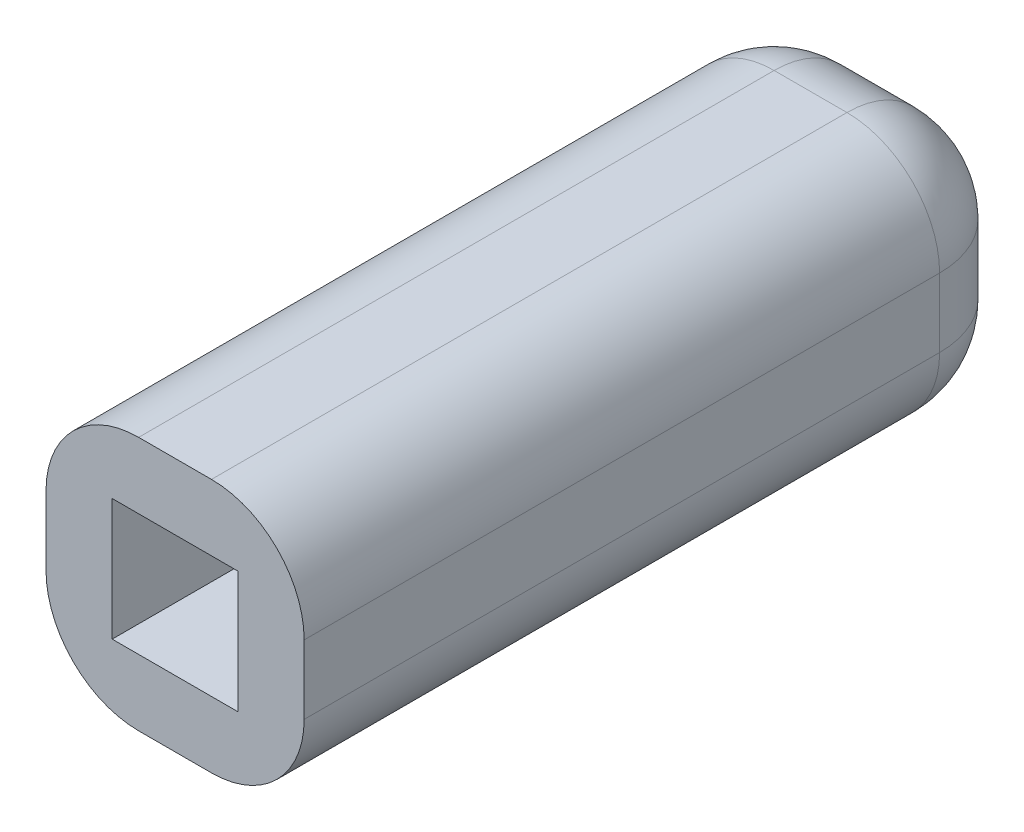
ISO-10303-21;
HEADER;
FILE_DESCRIPTION(('STEP AP214'),'2;1');
FILE_NAME('part.step','',(''),(''),'','','');
FILE_SCHEMA(('AUTOMOTIVE_DESIGN { 1 0 10303 214 1 1 1 1 }'));
ENDSEC;
DATA;
#1=APPLICATION_CONTEXT('core data for automotive mechanical design processes');
#2=APPLICATION_PROTOCOL_DEFINITION('international standard','automotive_design',2000,#1);
#3=PRODUCT_CONTEXT('',#1,'mechanical');
#4=PRODUCT('Part','Part','',(#3));
#5=PRODUCT_RELATED_PRODUCT_CATEGORY('part','',(#4));
#6=PRODUCT_DEFINITION_FORMATION('','',#4);
#7=PRODUCT_DEFINITION_CONTEXT('part definition',#1,'design');
#8=PRODUCT_DEFINITION('design','',#6,#7);
#9=PRODUCT_DEFINITION_SHAPE('','',#8);
#10=(LENGTH_UNIT() NAMED_UNIT(*) SI_UNIT(.MILLI.,.METRE.));
#11=(NAMED_UNIT(*) PLANE_ANGLE_UNIT() SI_UNIT($,.RADIAN.));
#12=(NAMED_UNIT(*) SI_UNIT($,.STERADIAN.) SOLID_ANGLE_UNIT());
#13=UNCERTAINTY_MEASURE_WITH_UNIT(LENGTH_MEASURE(1.E-05),#10,'distance_accuracy_value','');
#14=(GEOMETRIC_REPRESENTATION_CONTEXT(3) GLOBAL_UNCERTAINTY_ASSIGNED_CONTEXT((#13)) GLOBAL_UNIT_ASSIGNED_CONTEXT((#10,
#11,#12)) REPRESENTATION_CONTEXT('',''));
#15=CARTESIAN_POINT('',(0.,0.,0.));
#16=DIRECTION('',(0.,0.,1.));
#17=DIRECTION('',(1.,0.,0.));
#18=AXIS2_PLACEMENT_3D('',#15,#16,#17);
#19=CARTESIAN_POINT('',(0.,0.,55.));
#20=DIRECTION('',(1.,0.,0.));
#21=DIRECTION('',(0.,0.,-1.));
#22=AXIS2_PLACEMENT_3D('',#19,#20,#21);
#23=PLANE('',#22);
#24=DIRECTION('',(0.,0.,-1.));
#25=VECTOR('',#24,1.);
#26=CARTESIAN_POINT('',(0.,0.,55.));
#27=LINE('',#26,#25);
#28=CARTESIAN_POINT('',(0.,0.,55.));
#29=VERTEX_POINT('',#28);
#30=CARTESIAN_POINT('',(0.,0.,25.));
#31=VERTEX_POINT('',#30);
#32=EDGE_CURVE('E167',#29,#31,#27,.T.);
#33=ORIENTED_EDGE('',*,*,#32,.T.);
#34=DIRECTION('',(0.,-1.,0.));
#35=VECTOR('',#34,1.);
#36=CARTESIAN_POINT('',(0.,0.,25.));
#37=LINE('',#36,#35);
#38=CARTESIAN_POINT('',(0.,9.2,25.));
#39=VERTEX_POINT('',#38);
#40=EDGE_CURVE('E152',#39,#31,#37,.T.);
#41=ORIENTED_EDGE('',*,*,#40,.F.);
#42=DIRECTION('',(0.,0.,-1.));
#43=VECTOR('',#42,1.);
#44=CARTESIAN_POINT('',(0.,9.2,55.));
#45=LINE('',#44,#43);
#46=CARTESIAN_POINT('',(0.,9.2,55.));
#47=VERTEX_POINT('',#46);
#48=EDGE_CURVE('E164',#47,#39,#45,.T.);
#49=ORIENTED_EDGE('',*,*,#48,.F.);
#50=DIRECTION('',(0.,-1.,0.));
#51=VECTOR('',#50,1.);
#52=CARTESIAN_POINT('',(0.,0.,55.));
#53=LINE('',#52,#51);
#54=EDGE_CURVE('E169',#47,#29,#53,.T.);
#55=ORIENTED_EDGE('',*,*,#54,.T.);
#56=EDGE_LOOP('',(#33,#41,#49,#55));
#57=FACE_BOUND('',#56,.T.);
#58=ADVANCED_FACE('F49',(#57),#23,.T.);
#59=CARTESIAN_POINT('',(0.,0.,55.));
#60=DIRECTION('',(0.,1.,0.));
#61=DIRECTION('',(0.,0.,1.));
#62=AXIS2_PLACEMENT_3D('',#59,#60,#61);
#63=PLANE('',#62);
#64=DIRECTION('',(0.,0.,-1.));
#65=VECTOR('',#64,1.);
#66=CARTESIAN_POINT('',(9.5,0.,55.));
#67=LINE('',#66,#65);
#68=CARTESIAN_POINT('',(9.5,0.,55.));
#69=VERTEX_POINT('',#68);
#70=CARTESIAN_POINT('',(9.5,0.,25.));
#71=VERTEX_POINT('',#70);
#72=EDGE_CURVE('E180',#69,#71,#67,.T.);
#73=ORIENTED_EDGE('',*,*,#72,.T.);
#74=DIRECTION('',(-1.,0.,0.));
#75=VECTOR('',#74,1.);
#76=CARTESIAN_POINT('',(0.,0.,25.));
#77=LINE('',#76,#75);
#78=EDGE_CURVE('E170',#71,#31,#77,.T.);
#79=ORIENTED_EDGE('',*,*,#78,.T.);
#80=ORIENTED_EDGE('',*,*,#32,.F.);
#81=DIRECTION('',(1.,0.,0.));
#82=VECTOR('',#81,1.);
#83=CARTESIAN_POINT('',(0.,0.,55.));
#84=LINE('',#83,#82);
#85=EDGE_CURVE('E648',#29,#69,#84,.T.);
#86=ORIENTED_EDGE('',*,*,#85,.T.);
#87=EDGE_LOOP('',(#73,#79,#80,#86));
#88=FACE_BOUND('',#87,.T.);
#89=ADVANCED_FACE('F371',(#88),#63,.T.);
#90=CARTESIAN_POINT('',(9.5,0.,55.));
#91=DIRECTION('',(-1.,0.,0.));
#92=DIRECTION('',(0.,0.,1.));
#93=AXIS2_PLACEMENT_3D('',#90,#91,#92);
#94=PLANE('',#93);
#95=DIRECTION('',(0.,0.,-1.));
#96=VECTOR('',#95,1.);
#97=CARTESIAN_POINT('',(9.5,9.2,55.));
#98=LINE('',#97,#96);
#99=CARTESIAN_POINT('',(9.5,9.2,55.));
#100=VERTEX_POINT('',#99);
#101=CARTESIAN_POINT('',(9.5,9.2,25.));
#102=VERTEX_POINT('',#101);
#103=EDGE_CURVE('E176',#100,#102,#98,.T.);
#104=ORIENTED_EDGE('',*,*,#103,.T.);
#105=DIRECTION('',(0.,-1.,0.));
#106=VECTOR('',#105,1.);
#107=CARTESIAN_POINT('',(9.5,0.,25.));
#108=LINE('',#107,#106);
#109=EDGE_CURVE('E155',#102,#71,#108,.T.);
#110=ORIENTED_EDGE('',*,*,#109,.T.);
#111=ORIENTED_EDGE('',*,*,#72,.F.);
#112=DIRECTION('',(0.,1.,0.));
#113=VECTOR('',#112,1.);
#114=CARTESIAN_POINT('',(9.5,0.,55.));
#115=LINE('',#114,#113);
#116=EDGE_CURVE('E182',#69,#100,#115,.T.);
#117=ORIENTED_EDGE('',*,*,#116,.T.);
#118=EDGE_LOOP('',(#104,#110,#111,#117));
#119=FACE_BOUND('',#118,.T.);
#120=ADVANCED_FACE('F376',(#119),#94,.T.);
#121=CARTESIAN_POINT('',(0.,9.2,55.));
#122=DIRECTION('',(0.,-1.,0.));
#123=DIRECTION('',(0.,0.,-1.));
#124=AXIS2_PLACEMENT_3D('',#121,#122,#123);
#125=PLANE('',#124);
#126=ORIENTED_EDGE('',*,*,#48,.T.);
#127=DIRECTION('',(-1.,0.,0.));
#128=VECTOR('',#127,1.);
#129=CARTESIAN_POINT('',(0.,9.2,25.));
#130=LINE('',#129,#128);
#131=EDGE_CURVE('E149',#102,#39,#130,.T.);
#132=ORIENTED_EDGE('',*,*,#131,.F.);
#133=ORIENTED_EDGE('',*,*,#103,.F.);
#134=DIRECTION('',(-1.,0.,0.));
#135=VECTOR('',#134,1.);
#136=CARTESIAN_POINT('',(0.,9.2,55.));
#137=LINE('',#136,#135);
#138=EDGE_CURVE('E174',#100,#47,#137,.T.);
#139=ORIENTED_EDGE('',*,*,#138,.T.);
#140=EDGE_LOOP('',(#126,#132,#133,#139));
#141=FACE_BOUND('',#140,.T.);
#142=ADVANCED_FACE('F172',(#141),#125,.T.);
#143=CARTESIAN_POINT('',(0.,0.,55.));
#144=DIRECTION('',(0.,0.,-1.));
#145=DIRECTION('',(-1.,0.,0.));
#146=AXIS2_PLACEMENT_3D('',#143,#144,#145);
#147=PLANE('',#146);
#148=DIRECTION('',(0.,1.,0.));
#149=VECTOR('',#148,1.);
#150=CARTESIAN_POINT('',(14.5,-5.,55.));
#151=LINE('',#150,#149);
#152=CARTESIAN_POINT('',(14.5,2.,55.));
#153=VERTEX_POINT('',#152);
#154=CARTESIAN_POINT('',(14.5,7.2,55.));
#155=VERTEX_POINT('',#154);
#156=EDGE_CURVE('E199',#153,#155,#151,.T.);
#157=ORIENTED_EDGE('',*,*,#156,.T.);
#158=CARTESIAN_POINT('',(7.5,7.2,55.));
#159=DIRECTION('',(0.,0.,-1.));
#160=DIRECTION('',(-1.,0.,0.));
#161=AXIS2_PLACEMENT_3D('',#158,#159,#160);
#162=CIRCLE('',#161,7.);
#163=CARTESIAN_POINT('',(7.5,14.2,55.));
#164=VERTEX_POINT('',#163);
#165=EDGE_CURVE('E248',#155,#164,#162,.F.);
#166=ORIENTED_EDGE('',*,*,#165,.T.);
#167=DIRECTION('',(-1.,0.,0.));
#168=VECTOR('',#167,1.);
#169=CARTESIAN_POINT('',(-5.,14.2,55.));
#170=LINE('',#169,#168);
#171=CARTESIAN_POINT('',(2.,14.2,55.));
#172=VERTEX_POINT('',#171);
#173=EDGE_CURVE('E203',#164,#172,#170,.T.);
#174=ORIENTED_EDGE('',*,*,#173,.T.);
#175=CARTESIAN_POINT('',(2.,7.2,55.));
#176=DIRECTION('',(0.,0.,-1.));
#177=DIRECTION('',(-1.,0.,0.));
#178=AXIS2_PLACEMENT_3D('',#175,#176,#177);
#179=CIRCLE('',#178,7.);
#180=CARTESIAN_POINT('',(-5.,7.2,55.));
#181=VERTEX_POINT('',#180);
#182=EDGE_CURVE('E245',#172,#181,#179,.F.);
#183=ORIENTED_EDGE('',*,*,#182,.T.);
#184=DIRECTION('',(0.,-1.,0.));
#185=VECTOR('',#184,1.);
#186=CARTESIAN_POINT('',(-5.,-5.,55.));
#187=LINE('',#186,#185);
#188=CARTESIAN_POINT('',(-5.,2.,55.));
#189=VERTEX_POINT('',#188);
#190=EDGE_CURVE('E191',#181,#189,#187,.T.);
#191=ORIENTED_EDGE('',*,*,#190,.T.);
#192=CARTESIAN_POINT('',(2.,2.,55.));
#193=DIRECTION('',(0.,0.,-1.));
#194=DIRECTION('',(-1.,0.,0.));
#195=AXIS2_PLACEMENT_3D('',#192,#193,#194);
#196=CIRCLE('',#195,7.);
#197=CARTESIAN_POINT('',(2.,-5.,55.));
#198=VERTEX_POINT('',#197);
#199=EDGE_CURVE('E242',#189,#198,#196,.F.);
#200=ORIENTED_EDGE('',*,*,#199,.T.);
#201=DIRECTION('',(1.,0.,0.));
#202=VECTOR('',#201,1.);
#203=CARTESIAN_POINT('',(-5.,-5.,55.));
#204=LINE('',#203,#202);
#205=CARTESIAN_POINT('',(7.5,-5.,55.));
#206=VERTEX_POINT('',#205);
#207=EDGE_CURVE('E195',#198,#206,#204,.T.);
#208=ORIENTED_EDGE('',*,*,#207,.T.);
#209=CARTESIAN_POINT('',(7.5,2.,55.));
#210=DIRECTION('',(0.,0.,-1.));
#211=DIRECTION('',(-1.,0.,0.));
#212=AXIS2_PLACEMENT_3D('',#209,#210,#211);
#213=CIRCLE('',#212,7.);
#214=EDGE_CURVE('E239',#206,#153,#213,.F.);
#215=ORIENTED_EDGE('',*,*,#214,.T.);
#216=EDGE_LOOP('',(#157,#166,#174,#183,#191,#200,#208,#215));
#217=FACE_BOUND('',#216,.T.);
#218=ORIENTED_EDGE('',*,*,#54,.F.);
#219=ORIENTED_EDGE('',*,*,#138,.F.);
#220=ORIENTED_EDGE('',*,*,#116,.F.);
#221=ORIENTED_EDGE('',*,*,#85,.F.);
#222=EDGE_LOOP('',(#218,#219,#220,#221));
#223=FACE_BOUND('',#222,.T.);
#224=ADVANCED_FACE('F331',(#217,#223),#147,.F.);
#225=CARTESIAN_POINT('',(0.,0.,0.));
#226=DIRECTION('',(0.,0.,-1.));
#227=DIRECTION('',(-1.,0.,0.));
#228=AXIS2_PLACEMENT_3D('',#225,#226,#227);
#229=PLANE('',#228);
#230=DIRECTION('',(0.,-1.,0.));
#231=VECTOR('',#230,1.);
#232=CARTESIAN_POINT('',(2.,14.2,0.));
#233=LINE('',#232,#231);
#234=CARTESIAN_POINT('',(2.,2.,0.));
#235=VERTEX_POINT('',#234);
#236=CARTESIAN_POINT('',(2.,7.2,0.));
#237=VERTEX_POINT('',#236);
#238=EDGE_CURVE('E217',#235,#237,#233,.F.);
#239=ORIENTED_EDGE('',*,*,#238,.T.);
#240=DIRECTION('',(-1.,0.,0.));
#241=VECTOR('',#240,1.);
#242=CARTESIAN_POINT('',(14.5,7.2,0.));
#243=LINE('',#242,#241);
#244=CARTESIAN_POINT('',(7.5,7.2,0.));
#245=VERTEX_POINT('',#244);
#246=EDGE_CURVE('E226',#237,#245,#243,.F.);
#247=ORIENTED_EDGE('',*,*,#246,.T.);
#248=DIRECTION('',(0.,1.,0.));
#249=VECTOR('',#248,1.);
#250=CARTESIAN_POINT('',(7.5,-5.,0.));
#251=LINE('',#250,#249);
#252=CARTESIAN_POINT('',(7.5,2.,0.));
#253=VERTEX_POINT('',#252);
#254=EDGE_CURVE('E223',#245,#253,#251,.F.);
#255=ORIENTED_EDGE('',*,*,#254,.T.);
#256=DIRECTION('',(1.,0.,0.));
#257=VECTOR('',#256,1.);
#258=CARTESIAN_POINT('',(-5.,2.,0.));
#259=LINE('',#258,#257);
#260=EDGE_CURVE('E220',#253,#235,#259,.F.);
#261=ORIENTED_EDGE('',*,*,#260,.T.);
#262=EDGE_LOOP('',(#239,#247,#255,#261));
#263=FACE_BOUND('',#262,.T.);
#264=ADVANCED_FACE('F361',(#263),#229,.T.);
#265=CARTESIAN_POINT('',(-5.,-5.,55.));
#266=DIRECTION('',(1.,0.,0.));
#267=DIRECTION('',(0.,0.,-1.));
#268=AXIS2_PLACEMENT_3D('',#265,#266,#267);
#269=PLANE('',#268);
#270=ORIENTED_EDGE('',*,*,#190,.F.);
#271=DIRECTION('',(0.,0.,-1.));
#272=VECTOR('',#271,1.);
#273=CARTESIAN_POINT('',(-5.,7.2,55.));
#274=LINE('',#273,#272);
#275=CARTESIAN_POINT('',(-5.,7.2,7.));
#276=VERTEX_POINT('',#275);
#277=EDGE_CURVE('E257',#181,#276,#274,.T.);
#278=ORIENTED_EDGE('',*,*,#277,.T.);
#279=DIRECTION('',(0.,-1.,0.));
#280=VECTOR('',#279,1.);
#281=CARTESIAN_POINT('',(-5.,-5.,7.));
#282=LINE('',#281,#280);
#283=CARTESIAN_POINT('',(-5.,2.,7.));
#284=VERTEX_POINT('',#283);
#285=EDGE_CURVE('E251',#276,#284,#282,.T.);
#286=ORIENTED_EDGE('',*,*,#285,.T.);
#287=DIRECTION('',(0.,0.,-1.));
#288=VECTOR('',#287,1.);
#289=CARTESIAN_POINT('',(-5.,2.,55.));
#290=LINE('',#289,#288);
#291=EDGE_CURVE('E254',#284,#189,#290,.F.);
#292=ORIENTED_EDGE('',*,*,#291,.T.);
#293=EDGE_LOOP('',(#270,#278,#286,#292));
#294=FACE_BOUND('',#293,.T.);
#295=ADVANCED_FACE('F345',(#294),#269,.F.);
#296=CARTESIAN_POINT('',(-5.,-5.,55.));
#297=DIRECTION('',(0.,1.,0.));
#298=DIRECTION('',(0.,0.,1.));
#299=AXIS2_PLACEMENT_3D('',#296,#297,#298);
#300=PLANE('',#299);
#301=ORIENTED_EDGE('',*,*,#207,.F.);
#302=DIRECTION('',(0.,0.,-1.));
#303=VECTOR('',#302,1.);
#304=CARTESIAN_POINT('',(2.,-5.,55.));
#305=LINE('',#304,#303);
#306=CARTESIAN_POINT('',(2.,-5.,7.));
#307=VERTEX_POINT('',#306);
#308=EDGE_CURVE('E12',#198,#307,#305,.T.);
#309=ORIENTED_EDGE('',*,*,#308,.T.);
#310=DIRECTION('',(1.,0.,0.));
#311=VECTOR('',#310,1.);
#312=CARTESIAN_POINT('',(14.5,-5.,7.));
#313=LINE('',#312,#311);
#314=CARTESIAN_POINT('',(7.5,-5.,7.));
#315=VERTEX_POINT('',#314);
#316=EDGE_CURVE('E66',#307,#315,#313,.T.);
#317=ORIENTED_EDGE('',*,*,#316,.T.);
#318=DIRECTION('',(0.,0.,-1.));
#319=VECTOR('',#318,1.);
#320=CARTESIAN_POINT('',(7.5,-5.,55.));
#321=LINE('',#320,#319);
#322=EDGE_CURVE('E59',#315,#206,#321,.F.);
#323=ORIENTED_EDGE('',*,*,#322,.T.);
#324=EDGE_LOOP('',(#301,#309,#317,#323));
#325=FACE_BOUND('',#324,.T.);
#326=ADVANCED_FACE('F389',(#325),#300,.F.);
#327=CARTESIAN_POINT('',(14.5,-5.,55.));
#328=DIRECTION('',(-1.,0.,0.));
#329=DIRECTION('',(0.,0.,1.));
#330=AXIS2_PLACEMENT_3D('',#327,#328,#329);
#331=PLANE('',#330);
#332=DIRECTION('',(0.,1.,0.));
#333=VECTOR('',#332,1.);
#334=CARTESIAN_POINT('',(14.5,14.2,7.));
#335=LINE('',#334,#333);
#336=CARTESIAN_POINT('',(14.5,2.,7.));
#337=VERTEX_POINT('',#336);
#338=CARTESIAN_POINT('',(14.5,7.2,7.));
#339=VERTEX_POINT('',#338);
#340=EDGE_CURVE('E230',#337,#339,#335,.T.);
#341=ORIENTED_EDGE('',*,*,#340,.T.);
#342=DIRECTION('',(0.,0.,-1.));
#343=VECTOR('',#342,1.);
#344=CARTESIAN_POINT('',(14.5,7.2,55.));
#345=LINE('',#344,#343);
#346=EDGE_CURVE('E236',#339,#155,#345,.F.);
#347=ORIENTED_EDGE('',*,*,#346,.T.);
#348=ORIENTED_EDGE('',*,*,#156,.F.);
#349=DIRECTION('',(0.,0.,-1.));
#350=VECTOR('',#349,1.);
#351=CARTESIAN_POINT('',(14.5,2.,55.));
#352=LINE('',#351,#350);
#353=EDGE_CURVE('E233',#153,#337,#352,.T.);
#354=ORIENTED_EDGE('',*,*,#353,.T.);
#355=EDGE_LOOP('',(#341,#347,#348,#354));
#356=FACE_BOUND('',#355,.T.);
#357=ADVANCED_FACE('F320',(#356),#331,.F.);
#358=CARTESIAN_POINT('',(-5.,14.2,55.));
#359=DIRECTION('',(0.,-1.,0.));
#360=DIRECTION('',(0.,0.,-1.));
#361=AXIS2_PLACEMENT_3D('',#358,#359,#360);
#362=PLANE('',#361);
#363=ORIENTED_EDGE('',*,*,#173,.F.);
#364=DIRECTION('',(0.,0.,-1.));
#365=VECTOR('',#364,1.);
#366=CARTESIAN_POINT('',(7.5,14.2,55.));
#367=LINE('',#366,#365);
#368=CARTESIAN_POINT('',(7.5,14.2,7.));
#369=VERTEX_POINT('',#368);
#370=EDGE_CURVE('E214',#164,#369,#367,.T.);
#371=ORIENTED_EDGE('',*,*,#370,.T.);
#372=DIRECTION('',(-1.,0.,0.));
#373=VECTOR('',#372,1.);
#374=CARTESIAN_POINT('',(-5.,14.2,7.));
#375=LINE('',#374,#373);
#376=CARTESIAN_POINT('',(2.,14.2,7.));
#377=VERTEX_POINT('',#376);
#378=EDGE_CURVE('E210',#369,#377,#375,.T.);
#379=ORIENTED_EDGE('',*,*,#378,.T.);
#380=DIRECTION('',(0.,0.,-1.));
#381=VECTOR('',#380,1.);
#382=CARTESIAN_POINT('',(2.,14.2,55.));
#383=LINE('',#382,#381);
#384=EDGE_CURVE('E207',#377,#172,#383,.F.);
#385=ORIENTED_EDGE('',*,*,#384,.T.);
#386=EDGE_LOOP('',(#363,#371,#379,#385));
#387=FACE_BOUND('',#386,.T.);
#388=ADVANCED_FACE('F335',(#387),#362,.F.);
#389=CARTESIAN_POINT('',(0.,0.,25.));
#390=DIRECTION('',(0.,0.,-1.));
#391=DIRECTION('',(-1.,0.,0.));
#392=AXIS2_PLACEMENT_3D('',#389,#390,#391);
#393=PLANE('',#392);
#394=ORIENTED_EDGE('',*,*,#109,.F.);
#395=ORIENTED_EDGE('',*,*,#131,.T.);
#396=ORIENTED_EDGE('',*,*,#40,.T.);
#397=ORIENTED_EDGE('',*,*,#78,.F.);
#398=EDGE_LOOP('',(#394,#395,#396,#397));
#399=FACE_BOUND('',#398,.T.);
#400=ADVANCED_FACE('F151',(#399),#393,.F.);
#401=CARTESIAN_POINT('',(7.5,2.,55.));
#402=DIRECTION('',(0.,0.,-1.));
#403=DIRECTION('',(-1.,0.,0.));
#404=AXIS2_PLACEMENT_3D('',#401,#402,#403);
#405=CYLINDRICAL_SURFACE('',#404,7.);
#406=ORIENTED_EDGE('',*,*,#214,.F.);
#407=ORIENTED_EDGE('',*,*,#322,.F.);
#408=CARTESIAN_POINT('',(7.5,2.,7.));
#409=DIRECTION('',(0.,0.,-1.));
#410=DIRECTION('',(-1.,0.,0.));
#411=AXIS2_PLACEMENT_3D('',#408,#409,#410);
#412=CIRCLE('',#411,7.);
#413=EDGE_CURVE('E301',#337,#315,#412,.T.);
#414=ORIENTED_EDGE('',*,*,#413,.F.);
#415=ORIENTED_EDGE('',*,*,#353,.F.);
#416=EDGE_LOOP('',(#406,#407,#414,#415));
#417=FACE_BOUND('',#416,.T.);
#418=ADVANCED_FACE('F51',(#417),#405,.T.);
#419=CARTESIAN_POINT('',(2.,2.,55.));
#420=DIRECTION('',(0.,0.,-1.));
#421=DIRECTION('',(-1.,0.,0.));
#422=AXIS2_PLACEMENT_3D('',#419,#420,#421);
#423=CYLINDRICAL_SURFACE('',#422,7.);
#424=ORIENTED_EDGE('',*,*,#199,.F.);
#425=ORIENTED_EDGE('',*,*,#291,.F.);
#426=CARTESIAN_POINT('',(2.,2.,7.));
#427=DIRECTION('',(0.,0.,-1.));
#428=DIRECTION('',(-1.,0.,0.));
#429=AXIS2_PLACEMENT_3D('',#426,#427,#428);
#430=CIRCLE('',#429,7.);
#431=EDGE_CURVE('E298',#307,#284,#430,.T.);
#432=ORIENTED_EDGE('',*,*,#431,.F.);
#433=ORIENTED_EDGE('',*,*,#308,.F.);
#434=EDGE_LOOP('',(#424,#425,#432,#433));
#435=FACE_BOUND('',#434,.T.);
#436=ADVANCED_FACE('F350',(#435),#423,.T.);
#437=CARTESIAN_POINT('',(-5.,2.,7.));
#438=DIRECTION('',(-1.,0.,0.));
#439=DIRECTION('',(0.,0.,1.));
#440=AXIS2_PLACEMENT_3D('',#437,#438,#439);
#441=CYLINDRICAL_SURFACE('',#440,7.);
#442=CARTESIAN_POINT('',(7.5,2.,7.));
#443=DIRECTION('',(1.,0.,0.));
#444=DIRECTION('',(0.,0.,-1.));
#445=AXIS2_PLACEMENT_3D('',#442,#443,#444);
#446=CIRCLE('',#445,7.);
#447=EDGE_CURVE('E53',#315,#253,#446,.T.);
#448=ORIENTED_EDGE('',*,*,#447,.F.);
#449=ORIENTED_EDGE('',*,*,#316,.F.);
#450=CARTESIAN_POINT('',(2.,2.,7.));
#451=DIRECTION('',(-1.,0.,0.));
#452=DIRECTION('',(0.,0.,1.));
#453=AXIS2_PLACEMENT_3D('',#450,#451,#452);
#454=CIRCLE('',#453,7.);
#455=EDGE_CURVE('E294',#235,#307,#454,.T.);
#456=ORIENTED_EDGE('',*,*,#455,.F.);
#457=ORIENTED_EDGE('',*,*,#260,.F.);
#458=EDGE_LOOP('',(#448,#449,#456,#457));
#459=FACE_BOUND('',#458,.T.);
#460=ADVANCED_FACE('F362',(#459),#441,.T.);
#461=CARTESIAN_POINT('',(7.5,2.,7.));
#462=DIRECTION('',(0.,-1.,0.));
#463=DIRECTION('',(0.,0.,-1.));
#464=AXIS2_PLACEMENT_3D('',#461,#462,#463);
#465=SPHERICAL_SURFACE('',#464,7.);
#466=ORIENTED_EDGE('',*,*,#413,.T.);
#467=ORIENTED_EDGE('',*,*,#447,.T.);
#468=CARTESIAN_POINT('',(7.5,2.,7.));
#469=DIRECTION('',(0.,-1.,0.));
#470=DIRECTION('',(0.,0.,-1.));
#471=AXIS2_PLACEMENT_3D('',#468,#469,#470);
#472=CIRCLE('',#471,7.);
#473=EDGE_CURVE('E290',#337,#253,#472,.F.);
#474=ORIENTED_EDGE('',*,*,#473,.F.);
#475=EDGE_LOOP('',(#466,#467,#474));
#476=FACE_BOUND('',#475,.T.);
#477=ADVANCED_FACE('F310',(#476),#465,.T.);
#478=CARTESIAN_POINT('',(2.,2.,7.));
#479=DIRECTION('',(0.,-1.,0.));
#480=DIRECTION('',(0.,0.,-1.));
#481=AXIS2_PLACEMENT_3D('',#478,#479,#480);
#482=SPHERICAL_SURFACE('',#481,7.);
#483=ORIENTED_EDGE('',*,*,#455,.T.);
#484=ORIENTED_EDGE('',*,*,#431,.T.);
#485=CARTESIAN_POINT('',(2.,2.,7.));
#486=DIRECTION('',(0.,-1.,0.));
#487=DIRECTION('',(0.,0.,-1.));
#488=AXIS2_PLACEMENT_3D('',#485,#486,#487);
#489=CIRCLE('',#488,7.);
#490=EDGE_CURVE('E286',#235,#284,#489,.F.);
#491=ORIENTED_EDGE('',*,*,#490,.F.);
#492=EDGE_LOOP('',(#483,#484,#491));
#493=FACE_BOUND('',#492,.T.);
#494=ADVANCED_FACE('F353',(#493),#482,.T.);
#495=CARTESIAN_POINT('',(7.5,-5.,7.));
#496=DIRECTION('',(0.,-1.,0.));
#497=DIRECTION('',(0.,0.,-1.));
#498=AXIS2_PLACEMENT_3D('',#495,#496,#497);
#499=CYLINDRICAL_SURFACE('',#498,7.);
#500=ORIENTED_EDGE('',*,*,#473,.T.);
#501=ORIENTED_EDGE('',*,*,#254,.F.);
#502=CARTESIAN_POINT('',(7.5,7.2,7.));
#503=DIRECTION('',(0.,1.,0.));
#504=DIRECTION('',(0.,0.,1.));
#505=AXIS2_PLACEMENT_3D('',#502,#503,#504);
#506=CIRCLE('',#505,7.);
#507=EDGE_CURVE('E282',#339,#245,#506,.T.);
#508=ORIENTED_EDGE('',*,*,#507,.F.);
#509=ORIENTED_EDGE('',*,*,#340,.F.);
#510=EDGE_LOOP('',(#500,#501,#508,#509));
#511=FACE_BOUND('',#510,.T.);
#512=ADVANCED_FACE('F316',(#511),#499,.T.);
#513=CARTESIAN_POINT('',(7.5,7.2,55.));
#514=DIRECTION('',(0.,0.,-1.));
#515=DIRECTION('',(-1.,0.,0.));
#516=AXIS2_PLACEMENT_3D('',#513,#514,#515);
#517=CYLINDRICAL_SURFACE('',#516,7.);
#518=ORIENTED_EDGE('',*,*,#165,.F.);
#519=ORIENTED_EDGE('',*,*,#346,.F.);
#520=CARTESIAN_POINT('',(7.5,7.2,7.));
#521=DIRECTION('',(0.,0.,-1.));
#522=DIRECTION('',(-1.,0.,0.));
#523=AXIS2_PLACEMENT_3D('',#520,#521,#522);
#524=CIRCLE('',#523,7.);
#525=EDGE_CURVE('E278',#369,#339,#524,.T.);
#526=ORIENTED_EDGE('',*,*,#525,.F.);
#527=ORIENTED_EDGE('',*,*,#370,.F.);
#528=EDGE_LOOP('',(#518,#519,#526,#527));
#529=FACE_BOUND('',#528,.T.);
#530=ADVANCED_FACE('F326',(#529),#517,.T.);
#531=CARTESIAN_POINT('',(2.,7.2,55.));
#532=DIRECTION('',(0.,0.,-1.));
#533=DIRECTION('',(-1.,0.,0.));
#534=AXIS2_PLACEMENT_3D('',#531,#532,#533);
#535=CYLINDRICAL_SURFACE('',#534,7.);
#536=ORIENTED_EDGE('',*,*,#182,.F.);
#537=ORIENTED_EDGE('',*,*,#384,.F.);
#538=CARTESIAN_POINT('',(2.,7.2,7.));
#539=DIRECTION('',(0.,0.,-1.));
#540=DIRECTION('',(-1.,0.,0.));
#541=AXIS2_PLACEMENT_3D('',#538,#539,#540);
#542=CIRCLE('',#541,7.);
#543=EDGE_CURVE('E274',#276,#377,#542,.T.);
#544=ORIENTED_EDGE('',*,*,#543,.F.);
#545=ORIENTED_EDGE('',*,*,#277,.F.);
#546=EDGE_LOOP('',(#536,#537,#544,#545));
#547=FACE_BOUND('',#546,.T.);
#548=ADVANCED_FACE('F340',(#547),#535,.T.);
#549=CARTESIAN_POINT('',(2.,-5.,7.));
#550=DIRECTION('',(0.,1.,0.));
#551=DIRECTION('',(0.,0.,1.));
#552=AXIS2_PLACEMENT_3D('',#549,#550,#551);
#553=CYLINDRICAL_SURFACE('',#552,7.);
#554=ORIENTED_EDGE('',*,*,#490,.T.);
#555=ORIENTED_EDGE('',*,*,#285,.F.);
#556=CARTESIAN_POINT('',(2.,7.2,7.));
#557=DIRECTION('',(0.,1.,0.));
#558=DIRECTION('',(0.,0.,1.));
#559=AXIS2_PLACEMENT_3D('',#556,#557,#558);
#560=CIRCLE('',#559,7.);
#561=EDGE_CURVE('E270',#237,#276,#560,.T.);
#562=ORIENTED_EDGE('',*,*,#561,.F.);
#563=ORIENTED_EDGE('',*,*,#238,.F.);
#564=EDGE_LOOP('',(#554,#555,#562,#563));
#565=FACE_BOUND('',#564,.T.);
#566=ADVANCED_FACE('F357',(#565),#553,.T.);
#567=CARTESIAN_POINT('',(7.5,7.2,7.));
#568=DIRECTION('',(1.,0.,0.));
#569=DIRECTION('',(0.,0.,-1.));
#570=AXIS2_PLACEMENT_3D('',#567,#568,#569);
#571=SPHERICAL_SURFACE('',#570,7.);
#572=ORIENTED_EDGE('',*,*,#525,.T.);
#573=ORIENTED_EDGE('',*,*,#507,.T.);
#574=CARTESIAN_POINT('',(7.5,7.2,7.));
#575=DIRECTION('',(1.,0.,0.));
#576=DIRECTION('',(0.,0.,-1.));
#577=AXIS2_PLACEMENT_3D('',#574,#575,#576);
#578=CIRCLE('',#577,7.);
#579=EDGE_CURVE('E267',#369,#245,#578,.F.);
#580=ORIENTED_EDGE('',*,*,#579,.F.);
#581=EDGE_LOOP('',(#572,#573,#580));
#582=FACE_BOUND('',#581,.T.);
#583=ADVANCED_FACE('F401',(#582),#571,.T.);
#584=CARTESIAN_POINT('',(2.,7.2,7.));
#585=DIRECTION('',(-1.,0.,0.));
#586=DIRECTION('',(0.,0.,1.));
#587=AXIS2_PLACEMENT_3D('',#584,#585,#586);
#588=SPHERICAL_SURFACE('',#587,7.);
#589=ORIENTED_EDGE('',*,*,#561,.T.);
#590=ORIENTED_EDGE('',*,*,#543,.T.);
#591=CARTESIAN_POINT('',(2.,7.2,7.));
#592=DIRECTION('',(-1.,0.,0.));
#593=DIRECTION('',(0.,0.,1.));
#594=AXIS2_PLACEMENT_3D('',#591,#592,#593);
#595=CIRCLE('',#594,7.);
#596=EDGE_CURVE('E264',#237,#377,#595,.F.);
#597=ORIENTED_EDGE('',*,*,#596,.F.);
#598=EDGE_LOOP('',(#589,#590,#597));
#599=FACE_BOUND('',#598,.T.);
#600=ADVANCED_FACE('F397',(#599),#588,.T.);
#601=CARTESIAN_POINT('',(-5.,7.2,7.));
#602=DIRECTION('',(1.,0.,0.));
#603=DIRECTION('',(0.,0.,-1.));
#604=AXIS2_PLACEMENT_3D('',#601,#602,#603);
#605=CYLINDRICAL_SURFACE('',#604,7.);
#606=ORIENTED_EDGE('',*,*,#579,.T.);
#607=ORIENTED_EDGE('',*,*,#246,.F.);
#608=ORIENTED_EDGE('',*,*,#596,.T.);
#609=ORIENTED_EDGE('',*,*,#378,.F.);
#610=EDGE_LOOP('',(#606,#607,#608,#609));
#611=FACE_BOUND('',#610,.T.);
#612=ADVANCED_FACE('F394',(#611),#605,.T.);
#613=CLOSED_SHELL('',(#58,#89,#120,#142,#224,#264,#295,#326,#357,#388,#400,#418,#436,#460,#477,
#494,#512,#530,#548,#566,#583,#600,#612));
#614=MANIFOLD_SOLID_BREP('B2',#613);
#615=ADVANCED_BREP_SHAPE_REPRESENTATION('',(#18,#614),#14);
#616=SHAPE_DEFINITION_REPRESENTATION(#9,#615);
ENDSEC;
END-ISO-10303-21;
